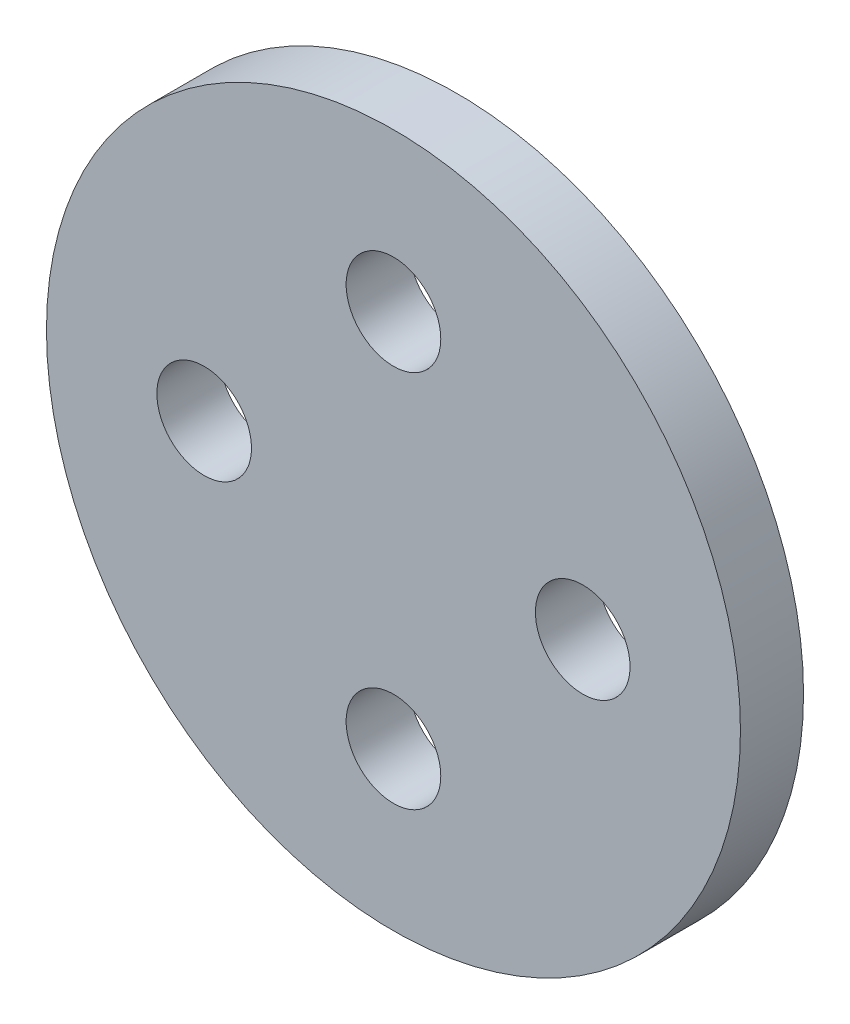
ISO-10303-21;
HEADER;
FILE_DESCRIPTION(('STEP AP214'),'2;1');
FILE_NAME('part.step','',(''),(''),'','','');
FILE_SCHEMA(('AUTOMOTIVE_DESIGN { 1 0 10303 214 1 1 1 1 }'));
ENDSEC;
DATA;
#1=APPLICATION_CONTEXT('core data for automotive mechanical design processes');
#2=APPLICATION_PROTOCOL_DEFINITION('international standard','automotive_design',2000,#1);
#3=PRODUCT_CONTEXT('',#1,'mechanical');
#4=PRODUCT('Part','Part','',(#3));
#5=PRODUCT_RELATED_PRODUCT_CATEGORY('part','',(#4));
#6=PRODUCT_DEFINITION_FORMATION('','',#4);
#7=PRODUCT_DEFINITION_CONTEXT('part definition',#1,'design');
#8=PRODUCT_DEFINITION('design','',#6,#7);
#9=PRODUCT_DEFINITION_SHAPE('','',#8);
#10=(LENGTH_UNIT() NAMED_UNIT(*) SI_UNIT(.MILLI.,.METRE.));
#11=(NAMED_UNIT(*) PLANE_ANGLE_UNIT() SI_UNIT($,.RADIAN.));
#12=(NAMED_UNIT(*) SI_UNIT($,.STERADIAN.) SOLID_ANGLE_UNIT());
#13=UNCERTAINTY_MEASURE_WITH_UNIT(LENGTH_MEASURE(1.E-05),#10,'distance_accuracy_value','');
#14=(GEOMETRIC_REPRESENTATION_CONTEXT(3) GLOBAL_UNCERTAINTY_ASSIGNED_CONTEXT((#13)) GLOBAL_UNIT_ASSIGNED_CONTEXT((#10,
#11,#12)) REPRESENTATION_CONTEXT('',''));
#15=CARTESIAN_POINT('',(0.,0.,0.));
#16=DIRECTION('',(0.,0.,1.));
#17=DIRECTION('',(1.,0.,0.));
#18=AXIS2_PLACEMENT_3D('',#15,#16,#17);
#19=CARTESIAN_POINT('',(0.,0.,3.175));
#20=DIRECTION('',(0.,0.,1.));
#21=DIRECTION('',(1.,0.,0.));
#22=AXIS2_PLACEMENT_3D('',#19,#20,#21);
#23=PLANE('',#22);
#24=CARTESIAN_POINT('',(5.39100612496821E-13,-9.525,3.175));
#25=DIRECTION('',(0.,0.,1.));
#26=DIRECTION('',(1.,0.,0.));
#27=AXIS2_PLACEMENT_3D('',#24,#25,#26);
#28=CIRCLE('',#27,2.38125000000058);
#29=CARTESIAN_POINT('',(2.38125000000112,-9.525,3.175));
#30=VERTEX_POINT('',#29);
#31=EDGE_CURVE('E53',#30,#30,#28,.T.);
#32=ORIENTED_EDGE('',*,*,#31,.F.);
#33=EDGE_LOOP('',(#32));
#34=FACE_BOUND('',#33,.T.);
#35=CARTESIAN_POINT('',(0.,9.525,3.175));
#36=DIRECTION('',(0.,0.,1.));
#37=DIRECTION('',(1.,0.,0.));
#38=AXIS2_PLACEMENT_3D('',#35,#36,#37);
#39=CIRCLE('',#38,2.38125);
#40=CARTESIAN_POINT('',(2.38125,9.525,3.175));
#41=VERTEX_POINT('',#40);
#42=EDGE_CURVE('E42',#41,#41,#39,.T.);
#43=ORIENTED_EDGE('',*,*,#42,.F.);
#44=EDGE_LOOP('',(#43));
#45=FACE_BOUND('',#44,.T.);
#46=CARTESIAN_POINT('',(0.,0.,3.175));
#47=DIRECTION('',(0.,0.,1.));
#48=DIRECTION('',(1.,0.,0.));
#49=AXIS2_PLACEMENT_3D('',#46,#47,#48);
#50=CIRCLE('',#49,17.4625);
#51=CARTESIAN_POINT('',(17.4625,0.,3.175));
#52=VERTEX_POINT('',#51);
#53=EDGE_CURVE('E10',#52,#52,#50,.T.);
#54=ORIENTED_EDGE('',*,*,#53,.T.);
#55=EDGE_LOOP('',(#54));
#56=FACE_BOUND('',#55,.T.);
#57=CARTESIAN_POINT('',(9.52500000000027,2.6955030624841E-13,3.175));
#58=DIRECTION('',(0.,0.,1.));
#59=DIRECTION('',(1.,0.,0.));
#60=AXIS2_PLACEMENT_3D('',#57,#58,#59);
#61=CIRCLE('',#60,2.38125000000021);
#62=CARTESIAN_POINT('',(11.9062500000005,2.6955030624841E-13,3.175));
#63=VERTEX_POINT('',#62);
#64=EDGE_CURVE('E47',#63,#63,#61,.T.);
#65=ORIENTED_EDGE('',*,*,#64,.F.);
#66=EDGE_LOOP('',(#65));
#67=FACE_BOUND('',#66,.T.);
#68=CARTESIAN_POINT('',(-9.52499999999973,-2.70716782324598E-13,3.175));
#69=DIRECTION('',(0.,0.,1.));
#70=DIRECTION('',(1.,0.,0.));
#71=AXIS2_PLACEMENT_3D('',#68,#69,#70);
#72=CIRCLE('',#71,2.38125000000043);
#73=CARTESIAN_POINT('',(-7.1437499999993,-2.70716782324598E-13,3.175));
#74=VERTEX_POINT('',#73);
#75=EDGE_CURVE('E59',#74,#74,#72,.T.);
#76=ORIENTED_EDGE('',*,*,#75,.F.);
#77=EDGE_LOOP('',(#76));
#78=FACE_BOUND('',#77,.T.);
#79=ADVANCED_FACE('F31',(#34,#45,#56,#67,#78),#23,.T.);
#80=CARTESIAN_POINT('',(0.,0.,0.));
#81=DIRECTION('',(0.,0.,1.));
#82=DIRECTION('',(1.,0.,0.));
#83=AXIS2_PLACEMENT_3D('',#80,#81,#82);
#84=PLANE('',#83);
#85=CARTESIAN_POINT('',(0.,0.,0.));
#86=DIRECTION('',(0.,0.,1.));
#87=DIRECTION('',(1.,0.,0.));
#88=AXIS2_PLACEMENT_3D('',#85,#86,#87);
#89=CIRCLE('',#88,17.4625);
#90=CARTESIAN_POINT('',(17.4625,0.,0.));
#91=VERTEX_POINT('',#90);
#92=EDGE_CURVE('E35',#91,#91,#89,.T.);
#93=ORIENTED_EDGE('',*,*,#92,.F.);
#94=EDGE_LOOP('',(#93));
#95=FACE_BOUND('',#94,.T.);
#96=CARTESIAN_POINT('',(0.,9.525,0.));
#97=DIRECTION('',(0.,0.,1.));
#98=DIRECTION('',(1.,0.,0.));
#99=AXIS2_PLACEMENT_3D('',#96,#97,#98);
#100=CIRCLE('',#99,2.38125);
#101=CARTESIAN_POINT('',(2.38125,9.525,0.));
#102=VERTEX_POINT('',#101);
#103=EDGE_CURVE('E44',#102,#102,#100,.T.);
#104=ORIENTED_EDGE('',*,*,#103,.T.);
#105=EDGE_LOOP('',(#104));
#106=FACE_BOUND('',#105,.T.);
#107=CARTESIAN_POINT('',(9.52500000000027,2.6955030624841E-13,0.));
#108=DIRECTION('',(0.,0.,1.));
#109=DIRECTION('',(1.,0.,0.));
#110=AXIS2_PLACEMENT_3D('',#107,#108,#109);
#111=CIRCLE('',#110,2.38125000000021);
#112=CARTESIAN_POINT('',(11.9062500000005,2.6955030624841E-13,0.));
#113=VERTEX_POINT('',#112);
#114=EDGE_CURVE('E50',#113,#113,#111,.T.);
#115=ORIENTED_EDGE('',*,*,#114,.T.);
#116=EDGE_LOOP('',(#115));
#117=FACE_BOUND('',#116,.T.);
#118=CARTESIAN_POINT('',(5.39100612496821E-13,-9.525,0.));
#119=DIRECTION('',(0.,0.,1.));
#120=DIRECTION('',(1.,0.,0.));
#121=AXIS2_PLACEMENT_3D('',#118,#119,#120);
#122=CIRCLE('',#121,2.38125000000058);
#123=CARTESIAN_POINT('',(2.38125000000112,-9.525,0.));
#124=VERTEX_POINT('',#123);
#125=EDGE_CURVE('E56',#124,#124,#122,.T.);
#126=ORIENTED_EDGE('',*,*,#125,.T.);
#127=EDGE_LOOP('',(#126));
#128=FACE_BOUND('',#127,.T.);
#129=CARTESIAN_POINT('',(-9.52499999999973,-2.70716782324598E-13,0.));
#130=DIRECTION('',(0.,0.,1.));
#131=DIRECTION('',(1.,0.,0.));
#132=AXIS2_PLACEMENT_3D('',#129,#130,#131);
#133=CIRCLE('',#132,2.38125000000043);
#134=CARTESIAN_POINT('',(-7.1437499999993,-2.70716782324598E-13,0.));
#135=VERTEX_POINT('',#134);
#136=EDGE_CURVE('E62',#135,#135,#133,.T.);
#137=ORIENTED_EDGE('',*,*,#136,.T.);
#138=EDGE_LOOP('',(#137));
#139=FACE_BOUND('',#138,.T.);
#140=ADVANCED_FACE('F72',(#95,#106,#117,#128,#139),#84,.F.);
#141=CARTESIAN_POINT('',(0.,0.,3.175));
#142=DIRECTION('',(0.,0.,-1.));
#143=DIRECTION('',(-1.,0.,0.));
#144=AXIS2_PLACEMENT_3D('',#141,#142,#143);
#145=CYLINDRICAL_SURFACE('',#144,17.4625);
#146=ORIENTED_EDGE('',*,*,#53,.F.);
#147=EDGE_LOOP('',(#146));
#148=FACE_BOUND('',#147,.T.);
#149=ORIENTED_EDGE('',*,*,#92,.T.);
#150=EDGE_LOOP('',(#149));
#151=FACE_BOUND('',#150,.T.);
#152=ADVANCED_FACE('F33',(#148,#151),#145,.T.);
#153=CARTESIAN_POINT('',(0.,9.525,3.175));
#154=DIRECTION('',(0.,0.,-1.));
#155=DIRECTION('',(-1.,0.,0.));
#156=AXIS2_PLACEMENT_3D('',#153,#154,#155);
#157=CYLINDRICAL_SURFACE('',#156,2.38125);
#158=ORIENTED_EDGE('',*,*,#42,.T.);
#159=EDGE_LOOP('',(#158));
#160=FACE_BOUND('',#159,.T.);
#161=ORIENTED_EDGE('',*,*,#103,.F.);
#162=EDGE_LOOP('',(#161));
#163=FACE_BOUND('',#162,.T.);
#164=ADVANCED_FACE('F82',(#160,#163),#157,.F.);
#165=CARTESIAN_POINT('',(9.52500000000027,2.6955030624841E-13,3.175));
#166=DIRECTION('',(0.,0.,-1.));
#167=DIRECTION('',(-1.,0.,0.));
#168=AXIS2_PLACEMENT_3D('',#165,#166,#167);
#169=CYLINDRICAL_SURFACE('',#168,2.38125000000021);
#170=ORIENTED_EDGE('',*,*,#64,.T.);
#171=EDGE_LOOP('',(#170));
#172=FACE_BOUND('',#171,.T.);
#173=ORIENTED_EDGE('',*,*,#114,.F.);
#174=EDGE_LOOP('',(#173));
#175=FACE_BOUND('',#174,.T.);
#176=ADVANCED_FACE('F85',(#172,#175),#169,.F.);
#177=CARTESIAN_POINT('',(5.39100612496821E-13,-9.525,3.175));
#178=DIRECTION('',(0.,0.,-1.));
#179=DIRECTION('',(-1.,0.,0.));
#180=AXIS2_PLACEMENT_3D('',#177,#178,#179);
#181=CYLINDRICAL_SURFACE('',#180,2.38125000000058);
#182=ORIENTED_EDGE('',*,*,#31,.T.);
#183=EDGE_LOOP('',(#182));
#184=FACE_BOUND('',#183,.T.);
#185=ORIENTED_EDGE('',*,*,#125,.F.);
#186=EDGE_LOOP('',(#185));
#187=FACE_BOUND('',#186,.T.);
#188=ADVANCED_FACE('F89',(#184,#187),#181,.F.);
#189=CARTESIAN_POINT('',(-9.52499999999973,-2.70716782324598E-13,3.175));
#190=DIRECTION('',(0.,0.,-1.));
#191=DIRECTION('',(-1.,0.,0.));
#192=AXIS2_PLACEMENT_3D('',#189,#190,#191);
#193=CYLINDRICAL_SURFACE('',#192,2.38125000000043);
#194=ORIENTED_EDGE('',*,*,#75,.T.);
#195=EDGE_LOOP('',(#194));
#196=FACE_BOUND('',#195,.T.);
#197=ORIENTED_EDGE('',*,*,#136,.F.);
#198=EDGE_LOOP('',(#197));
#199=FACE_BOUND('',#198,.T.);
#200=ADVANCED_FACE('F68',(#196,#199),#193,.F.);
#201=CLOSED_SHELL('',(#79,#140,#152,#164,#176,#188,#200));
#202=MANIFOLD_SOLID_BREP('B2',#201);
#203=ADVANCED_BREP_SHAPE_REPRESENTATION('',(#18,#202),#14);
#204=SHAPE_DEFINITION_REPRESENTATION(#9,#203);
ENDSEC;
END-ISO-10303-21;
